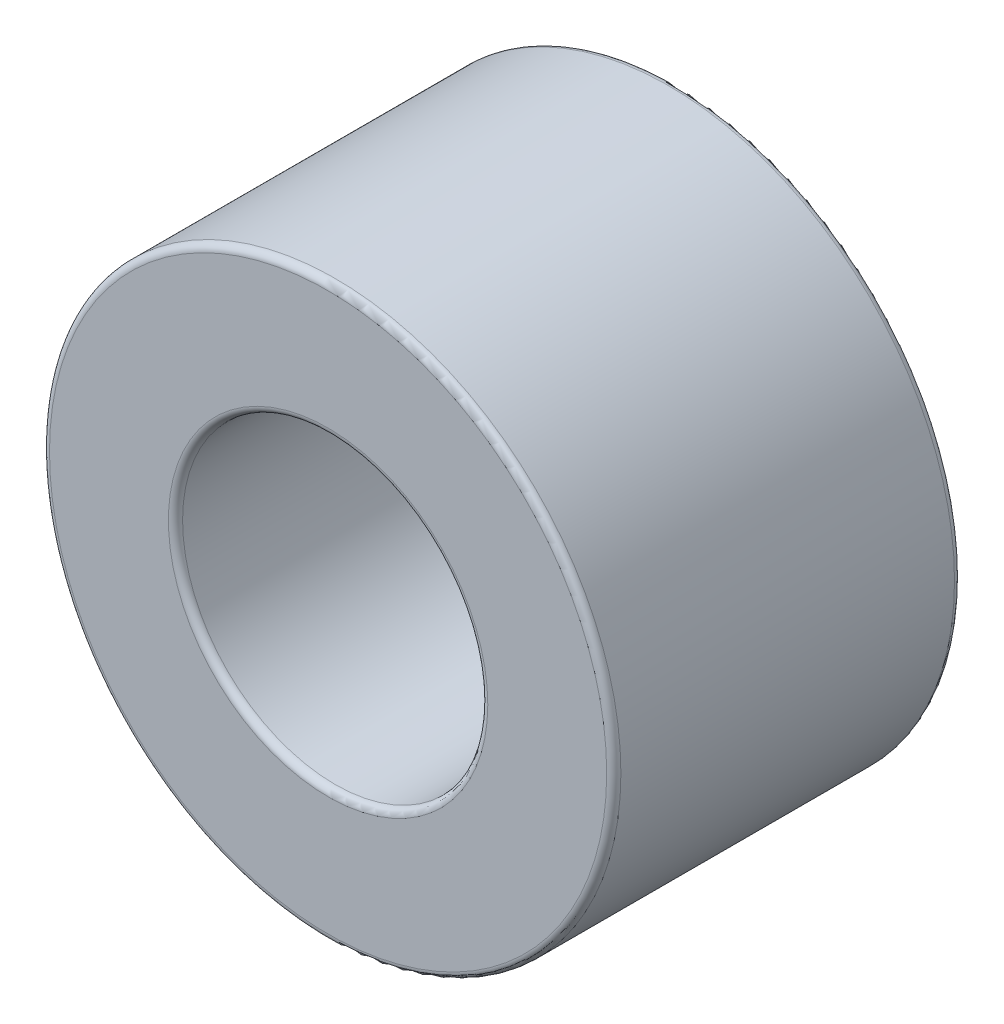
ISO-10303-21;
HEADER;
FILE_DESCRIPTION(('STEP AP214'),'2;1');
FILE_NAME('part.step','',(''),(''),'','','');
FILE_SCHEMA(('AUTOMOTIVE_DESIGN { 1 0 10303 214 1 1 1 1 }'));
ENDSEC;
DATA;
#1=APPLICATION_CONTEXT('core data for automotive mechanical design processes');
#2=APPLICATION_PROTOCOL_DEFINITION('international standard','automotive_design',2000,#1);
#3=PRODUCT_CONTEXT('',#1,'mechanical');
#4=PRODUCT('Part','Part','',(#3));
#5=PRODUCT_RELATED_PRODUCT_CATEGORY('part','',(#4));
#6=PRODUCT_DEFINITION_FORMATION('','',#4);
#7=PRODUCT_DEFINITION_CONTEXT('part definition',#1,'design');
#8=PRODUCT_DEFINITION('design','',#6,#7);
#9=PRODUCT_DEFINITION_SHAPE('','',#8);
#10=(LENGTH_UNIT() NAMED_UNIT(*) SI_UNIT(.MILLI.,.METRE.));
#11=(NAMED_UNIT(*) PLANE_ANGLE_UNIT() SI_UNIT($,.RADIAN.));
#12=(NAMED_UNIT(*) SI_UNIT($,.STERADIAN.) SOLID_ANGLE_UNIT());
#13=UNCERTAINTY_MEASURE_WITH_UNIT(LENGTH_MEASURE(1.E-05),#10,'distance_accuracy_value','');
#14=(GEOMETRIC_REPRESENTATION_CONTEXT(3) GLOBAL_UNCERTAINTY_ASSIGNED_CONTEXT((#13)) GLOBAL_UNIT_ASSIGNED_CONTEXT((#10,
#11,#12)) REPRESENTATION_CONTEXT('',''));
#15=CARTESIAN_POINT('',(0.,0.,0.));
#16=DIRECTION('',(0.,0.,1.));
#17=DIRECTION('',(1.,0.,0.));
#18=AXIS2_PLACEMENT_3D('',#15,#16,#17);
#19=CARTESIAN_POINT('',(0.,0.,12.446));
#20=DIRECTION('',(0.,0.,1.));
#21=DIRECTION('',(1.,0.,0.));
#22=AXIS2_PLACEMENT_3D('',#19,#20,#21);
#23=PLANE('',#22);
#24=CARTESIAN_POINT('',(0.,0.,12.446));
#25=DIRECTION('',(0.,0.,1.));
#26=DIRECTION('',(1.,0.,0.));
#27=AXIS2_PLACEMENT_3D('',#24,#25,#26);
#28=CIRCLE('',#27,5.715);
#29=CARTESIAN_POINT('',(5.715,0.,12.446));
#30=VERTEX_POINT('',#29);
#31=EDGE_CURVE('E10',#30,#30,#28,.F.);
#32=ORIENTED_EDGE('',*,*,#31,.T.);
#33=EDGE_LOOP('',(#32));
#34=FACE_BOUND('',#33,.T.);
#35=CARTESIAN_POINT('',(0.,0.,12.446));
#36=DIRECTION('',(0.,0.,1.));
#37=DIRECTION('',(1.,0.,0.));
#38=AXIS2_PLACEMENT_3D('',#35,#36,#37);
#39=CIRCLE('',#38,9.9695);
#40=CARTESIAN_POINT('',(9.9695,0.,12.446));
#41=VERTEX_POINT('',#40);
#42=EDGE_CURVE('E44',#41,#41,#39,.T.);
#43=ORIENTED_EDGE('',*,*,#42,.T.);
#44=EDGE_LOOP('',(#43));
#45=FACE_BOUND('',#44,.T.);
#46=ADVANCED_FACE('F37',(#34,#45),#23,.T.);
#47=CARTESIAN_POINT('',(0.,0.,0.));
#48=DIRECTION('',(0.,0.,1.));
#49=DIRECTION('',(1.,0.,0.));
#50=AXIS2_PLACEMENT_3D('',#47,#48,#49);
#51=PLANE('',#50);
#52=CARTESIAN_POINT('',(0.,0.,0.));
#53=DIRECTION('',(0.,0.,1.));
#54=DIRECTION('',(1.,0.,0.));
#55=AXIS2_PLACEMENT_3D('',#52,#53,#54);
#56=CIRCLE('',#55,5.715);
#57=CARTESIAN_POINT('',(5.715,0.,0.));
#58=VERTEX_POINT('',#57);
#59=EDGE_CURVE('E63',#58,#58,#56,.T.);
#60=ORIENTED_EDGE('',*,*,#59,.T.);
#61=EDGE_LOOP('',(#60));
#62=FACE_BOUND('',#61,.T.);
#63=CARTESIAN_POINT('',(0.,0.,0.));
#64=DIRECTION('',(0.,0.,1.));
#65=DIRECTION('',(1.,0.,0.));
#66=AXIS2_PLACEMENT_3D('',#63,#64,#65);
#67=CIRCLE('',#66,9.9695);
#68=CARTESIAN_POINT('',(9.9695,0.,0.));
#69=VERTEX_POINT('',#68);
#70=EDGE_CURVE('E66',#69,#69,#67,.F.);
#71=ORIENTED_EDGE('',*,*,#70,.T.);
#72=EDGE_LOOP('',(#71));
#73=FACE_BOUND('',#72,.T.);
#74=ADVANCED_FACE('F70',(#62,#73),#51,.F.);
#75=CARTESIAN_POINT('',(0.,0.,12.446));
#76=DIRECTION('',(0.,0.,-1.));
#77=DIRECTION('',(-1.,0.,0.));
#78=AXIS2_PLACEMENT_3D('',#75,#76,#77);
#79=CYLINDRICAL_SURFACE('',#78,10.2235);
#80=CARTESIAN_POINT('',(0.,0.,0.254000000000001));
#81=DIRECTION('',(0.,0.,1.));
#82=DIRECTION('',(1.,0.,0.));
#83=AXIS2_PLACEMENT_3D('',#80,#81,#82);
#84=CIRCLE('',#83,10.2235);
#85=CARTESIAN_POINT('',(10.2235,0.,0.254000000000001));
#86=VERTEX_POINT('',#85);
#87=EDGE_CURVE('E48',#86,#86,#84,.T.);
#88=ORIENTED_EDGE('',*,*,#87,.T.);
#89=EDGE_LOOP('',(#88));
#90=FACE_BOUND('',#89,.T.);
#91=CARTESIAN_POINT('',(0.,0.,12.192));
#92=DIRECTION('',(0.,0.,1.));
#93=DIRECTION('',(1.,0.,0.));
#94=AXIS2_PLACEMENT_3D('',#91,#92,#93);
#95=CIRCLE('',#94,10.2235);
#96=CARTESIAN_POINT('',(10.2235,0.,12.192));
#97=VERTEX_POINT('',#96);
#98=EDGE_CURVE('E52',#97,#97,#95,.F.);
#99=ORIENTED_EDGE('',*,*,#98,.T.);
#100=EDGE_LOOP('',(#99));
#101=FACE_BOUND('',#100,.T.);
#102=ADVANCED_FACE('F80',(#90,#101),#79,.T.);
#103=CARTESIAN_POINT('',(0.,0.,12.446));
#104=DIRECTION('',(0.,0.,-1.));
#105=DIRECTION('',(-1.,0.,0.));
#106=AXIS2_PLACEMENT_3D('',#103,#104,#105);
#107=CYLINDRICAL_SURFACE('',#106,5.461);
#108=CARTESIAN_POINT('',(0.,0.,0.254000000000001));
#109=DIRECTION('',(0.,0.,1.));
#110=DIRECTION('',(1.,0.,0.));
#111=AXIS2_PLACEMENT_3D('',#108,#109,#110);
#112=CIRCLE('',#111,5.461);
#113=CARTESIAN_POINT('',(5.461,0.,0.254000000000001));
#114=VERTEX_POINT('',#113);
#115=EDGE_CURVE('E57',#114,#114,#112,.F.);
#116=ORIENTED_EDGE('',*,*,#115,.T.);
#117=EDGE_LOOP('',(#116));
#118=FACE_BOUND('',#117,.T.);
#119=CARTESIAN_POINT('',(0.,0.,12.192));
#120=DIRECTION('',(0.,0.,1.));
#121=DIRECTION('',(1.,0.,0.));
#122=AXIS2_PLACEMENT_3D('',#119,#120,#121);
#123=CIRCLE('',#122,5.461);
#124=CARTESIAN_POINT('',(5.461,0.,12.192));
#125=VERTEX_POINT('',#124);
#126=EDGE_CURVE('E60',#125,#125,#123,.T.);
#127=ORIENTED_EDGE('',*,*,#126,.T.);
#128=EDGE_LOOP('',(#127));
#129=FACE_BOUND('',#128,.T.);
#130=ADVANCED_FACE('F83',(#118,#129),#107,.F.);
#131=CARTESIAN_POINT('',(0.,0.,0.254000000000001));
#132=DIRECTION('',(0.,0.,1.));
#133=DIRECTION('',(1.,0.,0.));
#134=AXIS2_PLACEMENT_3D('',#131,#132,#133);
#135=TOROIDAL_SURFACE('',#134,5.715,0.254);
#136=ORIENTED_EDGE('',*,*,#115,.F.);
#137=EDGE_LOOP('',(#136));
#138=FACE_BOUND('',#137,.T.);
#139=ORIENTED_EDGE('',*,*,#59,.F.);
#140=EDGE_LOOP('',(#139));
#141=FACE_BOUND('',#140,.T.);
#142=ADVANCED_FACE('F76',(#138,#141),#135,.T.);
#143=CARTESIAN_POINT('',(0.,0.,0.254000000000001));
#144=DIRECTION('',(0.,0.,1.));
#145=DIRECTION('',(1.,0.,0.));
#146=AXIS2_PLACEMENT_3D('',#143,#144,#145);
#147=TOROIDAL_SURFACE('',#146,9.9695,0.254);
#148=ORIENTED_EDGE('',*,*,#70,.F.);
#149=EDGE_LOOP('',(#148));
#150=FACE_BOUND('',#149,.T.);
#151=ORIENTED_EDGE('',*,*,#87,.F.);
#152=EDGE_LOOP('',(#151));
#153=FACE_BOUND('',#152,.T.);
#154=ADVANCED_FACE('F72',(#150,#153),#147,.T.);
#155=CARTESIAN_POINT('',(0.,0.,12.192));
#156=DIRECTION('',(0.,0.,1.));
#157=DIRECTION('',(1.,0.,0.));
#158=AXIS2_PLACEMENT_3D('',#155,#156,#157);
#159=TOROIDAL_SURFACE('',#158,5.715,0.254);
#160=ORIENTED_EDGE('',*,*,#31,.F.);
#161=EDGE_LOOP('',(#160));
#162=FACE_BOUND('',#161,.T.);
#163=ORIENTED_EDGE('',*,*,#126,.F.);
#164=EDGE_LOOP('',(#163));
#165=FACE_BOUND('',#164,.T.);
#166=ADVANCED_FACE('F75',(#162,#165),#159,.T.);
#167=CARTESIAN_POINT('',(0.,0.,12.192));
#168=DIRECTION('',(0.,0.,1.));
#169=DIRECTION('',(1.,0.,0.));
#170=AXIS2_PLACEMENT_3D('',#167,#168,#169);
#171=TOROIDAL_SURFACE('',#170,9.9695,0.254);
#172=ORIENTED_EDGE('',*,*,#98,.F.);
#173=EDGE_LOOP('',(#172));
#174=FACE_BOUND('',#173,.T.);
#175=ORIENTED_EDGE('',*,*,#42,.F.);
#176=EDGE_LOOP('',(#175));
#177=FACE_BOUND('',#176,.T.);
#178=ADVANCED_FACE('F39',(#174,#177),#171,.T.);
#179=CLOSED_SHELL('',(#46,#74,#102,#130,#142,#154,#166,#178));
#180=MANIFOLD_SOLID_BREP('B2',#179);
#181=ADVANCED_BREP_SHAPE_REPRESENTATION('',(#18,#180),#14);
#182=SHAPE_DEFINITION_REPRESENTATION(#9,#181);
ENDSEC;
END-ISO-10303-21;
